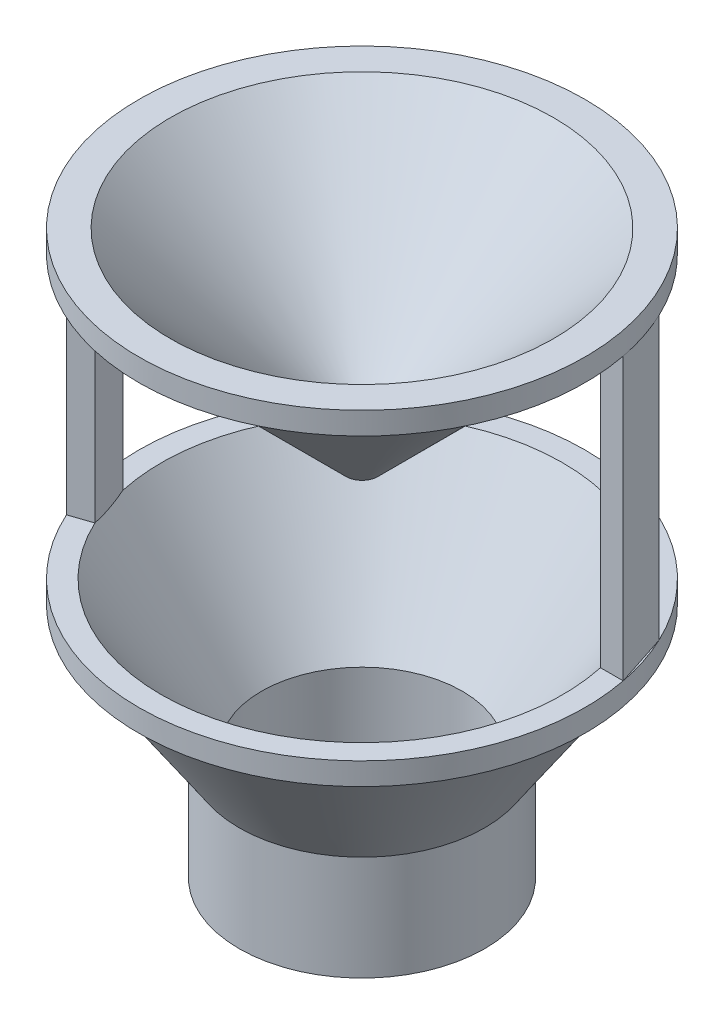
ISO-10303-21;
HEADER;
FILE_DESCRIPTION(('STEP AP214'),'2;1');
FILE_NAME('part.step','',(''),(''),'','','');
FILE_SCHEMA(('AUTOMOTIVE_DESIGN { 1 0 10303 214 1 1 1 1 }'));
ENDSEC;
DATA;
#1=APPLICATION_CONTEXT('core data for automotive mechanical design processes');
#2=APPLICATION_PROTOCOL_DEFINITION('international standard','automotive_design',2000,#1);
#3=PRODUCT_CONTEXT('',#1,'mechanical');
#4=PRODUCT('Part','Part','',(#3));
#5=PRODUCT_RELATED_PRODUCT_CATEGORY('part','',(#4));
#6=PRODUCT_DEFINITION_FORMATION('','',#4);
#7=PRODUCT_DEFINITION_CONTEXT('part definition',#1,'design');
#8=PRODUCT_DEFINITION('design','',#6,#7);
#9=PRODUCT_DEFINITION_SHAPE('','',#8);
#10=(LENGTH_UNIT() NAMED_UNIT(*) SI_UNIT(.MILLI.,.METRE.));
#11=(NAMED_UNIT(*) PLANE_ANGLE_UNIT() SI_UNIT($,.RADIAN.));
#12=(NAMED_UNIT(*) SI_UNIT($,.STERADIAN.) SOLID_ANGLE_UNIT());
#13=UNCERTAINTY_MEASURE_WITH_UNIT(LENGTH_MEASURE(1.E-05),#10,'distance_accuracy_value','');
#14=(GEOMETRIC_REPRESENTATION_CONTEXT(3) GLOBAL_UNCERTAINTY_ASSIGNED_CONTEXT((#13)) GLOBAL_UNIT_ASSIGNED_CONTEXT((#10,
#11,#12)) REPRESENTATION_CONTEXT('',''));
#15=CARTESIAN_POINT('',(0.,0.,0.));
#16=DIRECTION('',(0.,0.,1.));
#17=DIRECTION('',(1.,0.,0.));
#18=AXIS2_PLACEMENT_3D('',#15,#16,#17);
#19=CARTESIAN_POINT('',(-18.,13.2287565553229,0.));
#20=DIRECTION('',(0.,-1.,0.));
#21=DIRECTION('',(0.,0.,-1.));
#22=AXIS2_PLACEMENT_3D('',#19,#20,#21);
#23=PLANE('',#22);
#24=DIRECTION('',(-0.92606057951431,0.,0.37737488399418));
#25=VECTOR('',#24,1.);
#26=CARTESIAN_POINT('',(-15.8440931576,13.2287565553229,5.29049606778431));
#27=LINE('',#26,#25);
#28=CARTESIAN_POINT('',(18.0866902002161,13.2287565553229,-8.53648859903219));
#29=VERTEX_POINT('',#28);
#30=CARTESIAN_POINT('',(16.2315621436481,13.228756555323,-7.78051350341922));
#31=VERTEX_POINT('',#30);
#32=EDGE_CURVE('E137',#29,#31,#27,.T.);
#33=ORIENTED_EDGE('',*,*,#32,.F.);
#34=CARTESIAN_POINT('',(0.,13.2287565553229,0.));
#35=DIRECTION('',(0.,-1.,0.));
#36=DIRECTION('',(0.,0.,-1.));
#37=AXIS2_PLACEMENT_3D('',#34,#35,#36);
#38=CIRCLE('',#37,20.);
#39=CARTESIAN_POINT('',(-19.4879752206289,13.2287565553229,4.49653442110204));
#40=VERTEX_POINT('',#39);
#41=EDGE_CURVE('E537',#40,#29,#38,.T.);
#42=ORIENTED_EDGE('',*,*,#41,.F.);
#43=DIRECTION('',(-0.94703185385303,0.,0.321139639078848));
#44=VECTOR('',#43,1.);
#45=CARTESIAN_POINT('',(-16.7859272579792,13.2287565553229,3.58026671165951));
#46=LINE('',#45,#44);
#47=CARTESIAN_POINT('',(-17.5833000947419,13.2287565553229,3.8506567982943));
#48=VERTEX_POINT('',#47);
#49=EDGE_CURVE('E500',#48,#40,#46,.T.);
#50=ORIENTED_EDGE('',*,*,#49,.F.);
#51=CARTESIAN_POINT('',(0.,13.228756555323,0.));
#52=DIRECTION('',(0.,-1.,0.));
#53=DIRECTION('',(0.,0.,-1.));
#54=AXIS2_PLACEMENT_3D('',#51,#52,#53);
#55=CIRCLE('',#54,18.);
#56=EDGE_CURVE('E561',#48,#31,#55,.T.);
#57=ORIENTED_EDGE('',*,*,#56,.T.);
#58=EDGE_LOOP('',(#33,#42,#50,#57));
#59=FACE_BOUND('',#58,.T.);
#60=ADVANCED_FACE('F41',(#59),#23,.F.);
#61=DIRECTION('',(-0.310362269932768,0.,-0.950618357387537));
#62=VECTOR('',#61,1.);
#63=CARTESIAN_POINT('',(17.129221258251,13.2287565553229,-11.4691503335197));
#64=LINE('',#63,#62);
#65=CARTESIAN_POINT('',(19.6394429058073,13.2287565553229,-3.78051350341921));
#66=VERTEX_POINT('',#65);
#67=EDGE_CURVE('E455',#66,#29,#64,.T.);
#68=ORIENTED_EDGE('',*,*,#67,.F.);
#69=EDGE_CURVE('E577',#29,#66,#38,.T.);
#70=ORIENTED_EDGE('',*,*,#69,.F.);
#71=EDGE_LOOP('',(#68,#70));
#72=FACE_BOUND('',#71,.T.);
#73=ADVANCED_FACE('F267',(#72),#23,.F.);
#74=DIRECTION('',(1.,0.,0.));
#75=VECTOR('',#74,1.);
#76=CARTESIAN_POINT('',(-18.,13.2287565553229,-3.78051350341923));
#77=LINE('',#76,#75);
#78=CARTESIAN_POINT('',(17.5985146433006,13.228756555323,-3.78051350341921));
#79=VERTEX_POINT('',#78);
#80=EDGE_CURVE('E62',#79,#66,#77,.T.);
#81=ORIENTED_EDGE('',*,*,#80,.F.);
#82=CARTESIAN_POINT('',(-16.2987415384265,13.228756555323,7.63878421370643));
#83=VERTEX_POINT('',#82);
#84=EDGE_CURVE('E560',#79,#83,#55,.T.);
#85=ORIENTED_EDGE('',*,*,#84,.T.);
#86=DIRECTION('',(0.947031853853031,0.,-0.321139639078847));
#87=VECTOR('',#86,1.);
#88=CARTESIAN_POINT('',(-15.5013687016639,13.2287565553229,7.36839412707163));
#89=LINE('',#88,#87);
#90=CARTESIAN_POINT('',(-18.2034166643135,13.2287565553229,8.28466183651417));
#91=VERTEX_POINT('',#90);
#92=EDGE_CURVE('E503',#91,#83,#89,.T.);
#93=ORIENTED_EDGE('',*,*,#92,.F.);
#94=EDGE_CURVE('E531',#66,#91,#38,.T.);
#95=ORIENTED_EDGE('',*,*,#94,.F.);
#96=EDGE_LOOP('',(#81,#85,#93,#95));
#97=FACE_BOUND('',#96,.T.);
#98=ADVANCED_FACE('F225',(#97),#23,.F.);
#99=CARTESIAN_POINT('',(0.,0.,0.));
#100=DIRECTION('',(0.,1.,0.));
#101=DIRECTION('',(0.,0.,1.));
#102=AXIS2_PLACEMENT_3D('',#99,#100,#101);
#103=CONICAL_SURFACE('',#102,9.,0.59740641664535);
#104=CARTESIAN_POINT('',(0.,0.,0.));
#105=DIRECTION('',(0.,-1.,0.));
#106=DIRECTION('',(0.,0.,-1.));
#107=AXIS2_PLACEMENT_3D('',#104,#105,#106);
#108=CIRCLE('',#107,9.);
#109=CARTESIAN_POINT('',(0.,0.,-9.));
#110=VERTEX_POINT('',#109);
#111=EDGE_CURVE('E557',#110,#110,#108,.T.);
#112=ORIENTED_EDGE('',*,*,#111,.T.);
#113=EDGE_LOOP('',(#112));
#114=FACE_BOUND('',#113,.T.);
#115=CARTESIAN_POINT('',(17.0465181752272,13.2287741326992,-5.78071350341921));
#116=CARTESIAN_POINT('',(17.138526785594,13.1994453425449,-5.44731350341921));
#117=CARTESIAN_POINT('',(17.2305353959608,13.1847809474677,-5.11391350341921));
#118=CARTESIAN_POINT('',(17.4145526166944,13.1847809474677,-4.44711350341921));
#119=CARTESIAN_POINT('',(17.5065612270612,13.1994453425449,-4.11371350341921));
#120=CARTESIAN_POINT('',(17.598569837428,13.2287741326992,-3.78031350341921));
#121=B_SPLINE_CURVE_WITH_KNOTS('',3,(#115,#116,#117,#118,#119,#120),.UNSPECIFIED.,.F.,.F.,(4,2,
4),(0.,1.03852091927967,2.07704183855933),.UNSPECIFIED.);
#122=CARTESIAN_POINT('',(17.0465733693546,13.2287565553229,-5.78051350341921));
#123=VERTEX_POINT('',#122);
#124=EDGE_CURVE('E214',#123,#79,#121,.T.);
#125=ORIENTED_EDGE('',*,*,#124,.F.);
#126=CARTESIAN_POINT('',(16.2314806425256,13.2287756010906,-7.78071350341921));
#127=CARTESIAN_POINT('',(16.3673430138508,13.1969945114193,-7.44731350341921));
#128=CARTESIAN_POINT('',(16.5032053851761,13.1811039665836,-7.11391350341921));
#129=CARTESIAN_POINT('',(16.7749301278266,13.1811039665836,-6.44711350341921));
#130=CARTESIAN_POINT('',(16.9107924991519,13.1969945114193,-6.11371350341921));
#131=CARTESIAN_POINT('',(17.0466548704771,13.2287756010906,-5.78031350341921));
#132=B_SPLINE_CURVE_WITH_KNOTS('',3,(#126,#127,#128,#129,#130,#131),.UNSPECIFIED.,.F.,.F.,(4,2,
4),(0.,1.08111048474042,2.16222096948085),.UNSPECIFIED.);
#133=EDGE_CURVE('E70',#31,#123,#132,.T.);
#134=ORIENTED_EDGE('',*,*,#133,.F.);
#135=ORIENTED_EDGE('',*,*,#56,.F.);
#136=CARTESIAN_POINT('',(-16.2986737181863,13.2287910476154,7.63898421370642));
#137=CARTESIAN_POINT('',(-16.3519147051474,13.2017066190668,7.48197802559658));
#138=CARTESIAN_POINT('',(-16.405322491275,13.1778746899669,7.32447995138902));
#139=CARTESIAN_POINT('',(-16.5124046262886,13.1368843818071,7.00869771682161));
#140=CARTESIAN_POINT('',(-16.5660789917004,13.1197264218444,6.85041350772768));
#141=CARTESIAN_POINT('',(-16.7266532034287,13.078709404509,6.37688462835854));
#142=CARTESIAN_POINT('',(-16.8338370100064,13.0649313695642,6.06080256717945));
#143=CARTESIAN_POINT('',(-17.0482046231619,13.0649313695642,5.42863844482127));
#144=CARTESIAN_POINT('',(-17.1553884297397,13.078709404509,5.11255638364219));
#145=CARTESIAN_POINT('',(-17.315962641468,13.1197264218444,4.63902750427304));
#146=CARTESIAN_POINT('',(-17.3696370068797,13.1368843818071,4.48074329517912));
#147=CARTESIAN_POINT('',(-17.4767191418934,13.1778746899669,4.1649610606117));
#148=CARTESIAN_POINT('',(-17.530126928021,13.2017066190668,4.00746298640414));
#149=CARTESIAN_POINT('',(-17.5833679149821,13.2287910476154,3.8504567982943));
#150=B_SPLINE_CURVE_WITH_KNOTS('',3,(#136,#137,#138,#139,#140,#141,#142,#143,#144,#145,#146,
#147,#148,#149),.UNSPECIFIED.,.F.,.F.,(4,2,2,2,2,2,4),(0.,0.503897281712493,1.00782620094,
2.00876652283777,3.00970684473553,3.51363576396304,4.01753304567553),.UNSPECIFIED.);
#151=EDGE_CURVE('E128',#83,#48,#150,.T.);
#152=ORIENTED_EDGE('',*,*,#151,.F.);
#153=ORIENTED_EDGE('',*,*,#84,.F.);
#154=EDGE_LOOP('',(#125,#134,#135,#152,#153));
#155=FACE_BOUND('',#154,.T.);
#156=ADVANCED_FACE('F221',(#114,#155),#103,.F.);
#157=CARTESIAN_POINT('',(18.,38.4444165224714,0.));
#158=DIRECTION('',(0.,-1.,0.));
#159=DIRECTION('',(0.,0.,-1.));
#160=AXIS2_PLACEMENT_3D('',#157,#158,#159);
#161=PLANE('',#160);
#162=CARTESIAN_POINT('',(0.,38.4444165224714,0.));
#163=DIRECTION('',(0.,-1.,0.));
#164=DIRECTION('',(0.,0.,-1.));
#165=AXIS2_PLACEMENT_3D('',#162,#163,#164);
#166=CIRCLE('',#165,20.);
#167=CARTESIAN_POINT('',(-19.4879752206289,38.4444165224714,4.49653442110204));
#168=VERTEX_POINT('',#167);
#169=CARTESIAN_POINT('',(18.0866902002161,38.4444165224714,-8.53648859903214));
#170=VERTEX_POINT('',#169);
#171=EDGE_CURVE('E148',#168,#170,#166,.T.);
#172=ORIENTED_EDGE('',*,*,#171,.T.);
#173=DIRECTION('',(0.92606057951431,0.,-0.37737488399418));
#174=VECTOR('',#173,1.);
#175=CARTESIAN_POINT('',(16.2315621436481,38.4444165224714,-7.78051350341921));
#176=LINE('',#175,#174);
#177=CARTESIAN_POINT('',(16.2315621436481,38.4444165224714,-7.78051350341921));
#178=VERTEX_POINT('',#177);
#179=EDGE_CURVE('E135',#178,#170,#176,.T.);
#180=ORIENTED_EDGE('',*,*,#179,.F.);
#181=CARTESIAN_POINT('',(0.,38.4444165224714,0.));
#182=DIRECTION('',(0.,-1.,0.));
#183=DIRECTION('',(0.,0.,-1.));
#184=AXIS2_PLACEMENT_3D('',#181,#182,#183);
#185=CIRCLE('',#184,18.);
#186=CARTESIAN_POINT('',(-17.5833000947419,38.4444165224714,3.8506567982943));
#187=VERTEX_POINT('',#186);
#188=EDGE_CURVE('E145',#187,#178,#185,.T.);
#189=ORIENTED_EDGE('',*,*,#188,.F.);
#190=DIRECTION('',(0.94703185385303,0.,-0.321139639078848));
#191=VECTOR('',#190,1.);
#192=CARTESIAN_POINT('',(-17.5833000947419,38.4444165224714,3.8506567982943));
#193=LINE('',#192,#191);
#194=EDGE_CURVE('E498',#168,#187,#193,.T.);
#195=ORIENTED_EDGE('',*,*,#194,.F.);
#196=EDGE_LOOP('',(#172,#180,#189,#195));
#197=FACE_BOUND('',#196,.T.);
#198=ADVANCED_FACE('F144',(#197),#161,.T.);
#199=CARTESIAN_POINT('',(19.6394429058073,38.4444165224714,-3.78051350341921));
#200=VERTEX_POINT('',#199);
#201=EDGE_CURVE('E460',#170,#200,#166,.T.);
#202=ORIENTED_EDGE('',*,*,#201,.T.);
#203=DIRECTION('',(0.310362269932768,0.,0.950618357387538));
#204=VECTOR('',#203,1.);
#205=CARTESIAN_POINT('',(18.0866902002161,38.4444165224714,-8.53648859903214));
#206=LINE('',#205,#204);
#207=EDGE_CURVE('E150',#170,#200,#206,.T.);
#208=ORIENTED_EDGE('',*,*,#207,.F.);
#209=EDGE_LOOP('',(#202,#208));
#210=FACE_BOUND('',#209,.T.);
#211=ADVANCED_FACE('F292',(#210),#161,.T.);
#212=CARTESIAN_POINT('',(17.5985146433006,38.4444165224714,-3.78051350341921));
#213=VERTEX_POINT('',#212);
#214=CARTESIAN_POINT('',(-16.2987415384265,38.4444165224714,7.63878421370644));
#215=VERTEX_POINT('',#214);
#216=EDGE_CURVE('E156',#213,#215,#185,.T.);
#217=ORIENTED_EDGE('',*,*,#216,.F.);
#218=DIRECTION('',(-1.,0.,0.));
#219=VECTOR('',#218,1.);
#220=CARTESIAN_POINT('',(19.6394429058073,38.4444165224714,-3.78051350341921));
#221=LINE('',#220,#219);
#222=EDGE_CURVE('E437',#200,#213,#221,.T.);
#223=ORIENTED_EDGE('',*,*,#222,.F.);
#224=CARTESIAN_POINT('',(-18.2034166643135,38.4444165224714,8.28466183651417));
#225=VERTEX_POINT('',#224);
#226=EDGE_CURVE('E458',#200,#225,#166,.T.);
#227=ORIENTED_EDGE('',*,*,#226,.T.);
#228=DIRECTION('',(-0.947031853853031,0.,0.321139639078847));
#229=VECTOR('',#228,1.);
#230=CARTESIAN_POINT('',(-18.2034166643135,38.4444165224714,8.28466183651417));
#231=LINE('',#230,#229);
#232=EDGE_CURVE('E511',#215,#225,#231,.T.);
#233=ORIENTED_EDGE('',*,*,#232,.F.);
#234=EDGE_LOOP('',(#217,#223,#227,#233));
#235=FACE_BOUND('',#234,.T.);
#236=ADVANCED_FACE('F181',(#235),#161,.T.);
#237=CARTESIAN_POINT('',(0.,21.8725465406691,0.));
#238=DIRECTION('',(0.,1.,0.));
#239=DIRECTION('',(0.,0.,1.));
#240=AXIS2_PLACEMENT_3D('',#237,#238,#239);
#241=CONICAL_SURFACE('',#240,1.42813001819775,0.785398163397447);
#242=CARTESIAN_POINT('',(0.,21.8725465406691,0.));
#243=DIRECTION('',(0.,-1.,0.));
#244=DIRECTION('',(0.,0.,-1.));
#245=AXIS2_PLACEMENT_3D('',#242,#243,#244);
#246=CIRCLE('',#245,1.42813001819775);
#247=CARTESIAN_POINT('',(0.,21.8725465406691,-1.42813001819775));
#248=VERTEX_POINT('',#247);
#249=EDGE_CURVE('E162',#248,#248,#246,.T.);
#250=ORIENTED_EDGE('',*,*,#249,.F.);
#251=EDGE_LOOP('',(#250));
#252=FACE_BOUND('',#251,.T.);
#253=CARTESIAN_POINT('',(16.2314806425256,38.4444294799937,-7.78071350341921));
#254=CARTESIAN_POINT('',(16.3673430138508,38.422807658937,-7.44731350341921));
#255=CARTESIAN_POINT('',(16.5032053851761,38.4119967484087,-7.11391350341921));
#256=CARTESIAN_POINT('',(16.7749301278266,38.4119967484087,-6.44711350341921));
#257=CARTESIAN_POINT('',(16.9107924991519,38.422807658937,-6.11371350341921));
#258=CARTESIAN_POINT('',(17.0466548704771,38.4444294799937,-5.78031350341921));
#259=B_SPLINE_CURVE_WITH_KNOTS('',3,(#253,#254,#255,#256,#257,#258),.UNSPECIFIED.,.F.,.F.,(4,2,
4),(0.,1.08054577763146,2.16109155526292),.UNSPECIFIED.);
#260=CARTESIAN_POINT('',(17.0465733693546,38.4444165224714,-5.78051350341901));
#261=VERTEX_POINT('',#260);
#262=EDGE_CURVE('E55',#178,#261,#259,.T.);
#263=ORIENTED_EDGE('',*,*,#262,.T.);
#264=CARTESIAN_POINT('',(17.0465181752272,38.4444284809941,-5.78071350341921));
#265=CARTESIAN_POINT('',(17.138526785594,38.4244750477077,-5.44731350341921));
#266=CARTESIAN_POINT('',(17.2305353959608,38.4144983310645,-5.11391350341921));
#267=CARTESIAN_POINT('',(17.4145526166944,38.4144983310645,-4.44711350341921));
#268=CARTESIAN_POINT('',(17.5065612270612,38.4244750477077,-4.11371350341921));
#269=CARTESIAN_POINT('',(17.598569837428,38.4444284809941,-3.78031350341921));
#270=B_SPLINE_CURVE_WITH_KNOTS('',3,(#264,#265,#266,#267,#268,#269),.UNSPECIFIED.,.F.,.F.,(4,2,
4),(0.,1.03802028559633,2.07604057119265),.UNSPECIFIED.);
#271=EDGE_CURVE('E11',#261,#213,#270,.T.);
#272=ORIENTED_EDGE('',*,*,#271,.T.);
#273=ORIENTED_EDGE('',*,*,#216,.T.);
#274=CARTESIAN_POINT('',(-17.5833679149821,38.4444399888214,3.8504567982943));
#275=CARTESIAN_POINT('',(-17.4765859992348,38.4074245705533,4.16535369460475));
#276=CARTESIAN_POINT('',(-17.3694723952275,38.3795256229127,4.48122873035816));
#277=CARTESIAN_POINT('',(-17.1552454519501,38.3423220994446,5.11297802116276));
#278=CARTESIAN_POINT('',(-17.0481331342671,38.3329603424697,5.42884926358156));
#279=CARTESIAN_POINT('',(-16.8339084989013,38.3329603424697,6.06059174841916));
#280=CARTESIAN_POINT('',(-16.7267961812183,38.3423220994446,6.37646299083796));
#281=CARTESIAN_POINT('',(-16.5125692379409,38.3795256229127,7.00821228164256));
#282=CARTESIAN_POINT('',(-16.4054556339336,38.4074245705533,7.32408731739598));
#283=CARTESIAN_POINT('',(-16.2986737181863,38.4444399888214,7.63898421370642));
#284=B_SPLINE_CURVE_WITH_KNOTS('',3,(#274,#275,#276,#277,#278,#279,#280,#281,#282,#283),
.UNSPECIFIED.,.F.,.F.,(4,2,2,2,4),(0.,1.00359263996499,2.00408467330924,3.00457670665349,
4.00816934661848),.UNSPECIFIED.);
#285=EDGE_CURVE('E154',#187,#215,#284,.T.);
#286=ORIENTED_EDGE('',*,*,#285,.F.);
#287=ORIENTED_EDGE('',*,*,#188,.T.);
#288=EDGE_LOOP('',(#263,#272,#273,#286,#287));
#289=FACE_BOUND('',#288,.T.);
#290=ADVANCED_FACE('F152',(#252,#289),#241,.T.);
#291=DIRECTION('',(0.321139639078845,0.,0.947031853853031));
#292=VECTOR('',#291,1.);
#293=CARTESIAN_POINT('',(-20.7020479626496,13.2287565553229,0.916267709442525));
#294=LINE('',#293,#292);
#295=EDGE_CURVE('E528',#40,#91,#294,.T.);
#296=ORIENTED_EDGE('',*,*,#295,.F.);
#297=EDGE_CURVE('E532',#91,#40,#38,.T.);
#298=ORIENTED_EDGE('',*,*,#297,.F.);
#299=EDGE_LOOP('',(#296,#298));
#300=FACE_BOUND('',#299,.T.);
#301=ADVANCED_FACE('F180',(#300),#23,.F.);
#302=CARTESIAN_POINT('',(0.,0.,0.));
#303=DIRECTION('',(0.,-1.,0.));
#304=DIRECTION('',(0.,0.,-1.));
#305=AXIS2_PLACEMENT_3D('',#302,#303,#304);
#306=CYLINDRICAL_SURFACE('',#305,9.);
#307=ORIENTED_EDGE('',*,*,#111,.F.);
#308=EDGE_LOOP('',(#307));
#309=FACE_BOUND('',#308,.T.);
#310=CARTESIAN_POINT('',(0.,-10.,0.));
#311=DIRECTION('',(0.,-1.,0.));
#312=DIRECTION('',(0.,0.,-1.));
#313=AXIS2_PLACEMENT_3D('',#310,#311,#312);
#314=CIRCLE('',#313,9.);
#315=CARTESIAN_POINT('',(0.,-10.,-9.));
#316=VERTEX_POINT('',#315);
#317=EDGE_CURVE('E553',#316,#316,#314,.T.);
#318=ORIENTED_EDGE('',*,*,#317,.T.);
#319=EDGE_LOOP('',(#318));
#320=FACE_BOUND('',#319,.T.);
#321=ADVANCED_FACE('F227',(#309,#320),#306,.F.);
#322=CARTESIAN_POINT('',(-9.,-10.,0.));
#323=DIRECTION('',(0.,-1.,0.));
#324=DIRECTION('',(0.,0.,-1.));
#325=AXIS2_PLACEMENT_3D('',#322,#323,#324);
#326=PLANE('',#325);
#327=CARTESIAN_POINT('',(0.,-10.,0.));
#328=DIRECTION('',(0.,-1.,0.));
#329=DIRECTION('',(0.,0.,-1.));
#330=AXIS2_PLACEMENT_3D('',#327,#328,#329);
#331=CIRCLE('',#330,11.);
#332=CARTESIAN_POINT('',(0.,-10.,-11.));
#333=VERTEX_POINT('',#332);
#334=EDGE_CURVE('E549',#333,#333,#331,.T.);
#335=ORIENTED_EDGE('',*,*,#334,.T.);
#336=EDGE_LOOP('',(#335));
#337=FACE_BOUND('',#336,.T.);
#338=ORIENTED_EDGE('',*,*,#317,.F.);
#339=EDGE_LOOP('',(#338));
#340=FACE_BOUND('',#339,.T.);
#341=ADVANCED_FACE('F232',(#337,#340),#326,.T.);
#342=CARTESIAN_POINT('',(0.,0.,0.));
#343=DIRECTION('',(0.,-1.,0.));
#344=DIRECTION('',(0.,0.,-1.));
#345=AXIS2_PLACEMENT_3D('',#342,#343,#344);
#346=CYLINDRICAL_SURFACE('',#345,11.);
#347=CARTESIAN_POINT('',(0.,-0.615831876594899,0.));
#348=DIRECTION('',(0.,-1.,0.));
#349=DIRECTION('',(0.,0.,-1.));
#350=AXIS2_PLACEMENT_3D('',#347,#348,#349);
#351=CIRCLE('',#350,11.);
#352=CARTESIAN_POINT('',(0.,-0.615831876594899,-11.));
#353=VERTEX_POINT('',#352);
#354=EDGE_CURVE('E545',#353,#353,#351,.T.);
#355=ORIENTED_EDGE('',*,*,#354,.T.);
#356=EDGE_LOOP('',(#355));
#357=FACE_BOUND('',#356,.T.);
#358=ORIENTED_EDGE('',*,*,#334,.F.);
#359=EDGE_LOOP('',(#358));
#360=FACE_BOUND('',#359,.T.);
#361=ADVANCED_FACE('F236',(#357,#360),#346,.T.);
#362=CARTESIAN_POINT('',(0.,-0.615831876594899,0.));
#363=DIRECTION('',(0.,1.,0.));
#364=DIRECTION('',(0.,0.,1.));
#365=AXIS2_PLACEMENT_3D('',#362,#363,#364);
#366=CONICAL_SURFACE('',#365,11.,0.59740641664535);
#367=CARTESIAN_POINT('',(0.,11.2287565553229,0.));
#368=DIRECTION('',(0.,-1.,0.));
#369=DIRECTION('',(0.,0.,-1.));
#370=AXIS2_PLACEMENT_3D('',#367,#368,#369);
#371=CIRCLE('',#370,19.0583005244258);
#372=CARTESIAN_POINT('',(0.,11.2287565553229,-19.0583005244258));
#373=VERTEX_POINT('',#372);
#374=EDGE_CURVE('E541',#373,#373,#371,.T.);
#375=ORIENTED_EDGE('',*,*,#374,.T.);
#376=EDGE_LOOP('',(#375));
#377=FACE_BOUND('',#376,.T.);
#378=ORIENTED_EDGE('',*,*,#354,.F.);
#379=EDGE_LOOP('',(#378));
#380=FACE_BOUND('',#379,.T.);
#381=ADVANCED_FACE('F240',(#377,#380),#366,.T.);
#382=CARTESIAN_POINT('',(-18.,11.2287565553229,0.));
#383=DIRECTION('',(0.,-1.,0.));
#384=DIRECTION('',(0.,0.,-1.));
#385=AXIS2_PLACEMENT_3D('',#382,#383,#384);
#386=PLANE('',#385);
#387=CARTESIAN_POINT('',(0.,11.2287565553229,0.));
#388=DIRECTION('',(0.,-1.,0.));
#389=DIRECTION('',(0.,0.,-1.));
#390=AXIS2_PLACEMENT_3D('',#387,#388,#389);
#391=CIRCLE('',#390,20.);
#392=CARTESIAN_POINT('',(0.,11.2287565553229,-20.));
#393=VERTEX_POINT('',#392);
#394=EDGE_CURVE('E536',#393,#393,#391,.T.);
#395=ORIENTED_EDGE('',*,*,#394,.T.);
#396=EDGE_LOOP('',(#395));
#397=FACE_BOUND('',#396,.T.);
#398=ORIENTED_EDGE('',*,*,#374,.F.);
#399=EDGE_LOOP('',(#398));
#400=FACE_BOUND('',#399,.T.);
#401=ADVANCED_FACE('F244',(#397,#400),#386,.T.);
#402=CARTESIAN_POINT('',(0.,0.,0.));
#403=DIRECTION('',(0.,-1.,0.));
#404=DIRECTION('',(0.,0.,-1.));
#405=AXIS2_PLACEMENT_3D('',#402,#403,#404);
#406=CYLINDRICAL_SURFACE('',#405,20.);
#407=ORIENTED_EDGE('',*,*,#41,.T.);
#408=ORIENTED_EDGE('',*,*,#69,.T.);
#409=ORIENTED_EDGE('',*,*,#94,.T.);
#410=ORIENTED_EDGE('',*,*,#297,.T.);
#411=EDGE_LOOP('',(#407,#408,#409,#410));
#412=FACE_BOUND('',#411,.T.);
#413=ORIENTED_EDGE('',*,*,#394,.F.);
#414=EDGE_LOOP('',(#413));
#415=FACE_BOUND('',#414,.T.);
#416=ADVANCED_FACE('F248',(#412,#415),#406,.T.);
#417=CARTESIAN_POINT('',(-16.2987415384265,12.4444165224714,7.63878421370643));
#418=DIRECTION('',(-0.947031853853031,0.,0.321139639078845));
#419=DIRECTION('',(0.321139639078845,0.,0.947031853853031));
#420=AXIS2_PLACEMENT_3D('',#417,#418,#419);
#421=PLANE('',#420);
#422=DIRECTION('',(0.,1.,0.));
#423=VECTOR('',#422,1.);
#424=CARTESIAN_POINT('',(-17.5833000947419,12.4444165224714,3.8506567982943));
#425=LINE('',#424,#423);
#426=EDGE_CURVE('E504',#48,#187,#425,.T.);
#427=ORIENTED_EDGE('',*,*,#426,.T.);
#428=ORIENTED_EDGE('',*,*,#285,.T.);
#429=DIRECTION('',(0.,1.,0.));
#430=VECTOR('',#429,1.);
#431=CARTESIAN_POINT('',(-16.2987415384265,12.4444165224714,7.63878421370643));
#432=LINE('',#431,#430);
#433=EDGE_CURVE('E517',#83,#215,#432,.T.);
#434=ORIENTED_EDGE('',*,*,#433,.F.);
#435=ORIENTED_EDGE('',*,*,#151,.T.);
#436=EDGE_LOOP('',(#427,#428,#434,#435));
#437=FACE_BOUND('',#436,.T.);
#438=ADVANCED_FACE('F172',(#437),#421,.F.);
#439=CARTESIAN_POINT('',(-19.4879752206289,12.4444165224714,4.49653442110204));
#440=DIRECTION('',(0.947031853853031,0.,-0.321139639078845));
#441=DIRECTION('',(-0.321139639078845,0.,-0.947031853853031));
#442=AXIS2_PLACEMENT_3D('',#439,#440,#441);
#443=PLANE('',#442);
#444=DIRECTION('',(0.,1.,0.));
#445=VECTOR('',#444,1.);
#446=CARTESIAN_POINT('',(-19.4879752206289,12.4444165224714,4.49653442110204));
#447=LINE('',#446,#445);
#448=EDGE_CURVE('E497',#40,#168,#447,.T.);
#449=ORIENTED_EDGE('',*,*,#448,.F.);
#450=ORIENTED_EDGE('',*,*,#295,.T.);
#451=DIRECTION('',(0.,1.,0.));
#452=VECTOR('',#451,1.);
#453=CARTESIAN_POINT('',(-18.2034166643135,12.4444165224714,8.28466183651417));
#454=LINE('',#453,#452);
#455=EDGE_CURVE('E507',#91,#225,#454,.T.);
#456=ORIENTED_EDGE('',*,*,#455,.T.);
#457=DIRECTION('',(-0.321139639078845,0.,-0.947031853853031));
#458=VECTOR('',#457,1.);
#459=CARTESIAN_POINT('',(-19.4879752206289,38.4444165224714,4.49653442110204));
#460=LINE('',#459,#458);
#461=EDGE_CURVE('E160',#225,#168,#460,.T.);
#462=ORIENTED_EDGE('',*,*,#461,.T.);
#463=EDGE_LOOP('',(#449,#450,#456,#462));
#464=FACE_BOUND('',#463,.T.);
#465=ADVANCED_FACE('F253',(#464),#443,.F.);
#466=CARTESIAN_POINT('',(-17.5833000947419,12.4444165224714,3.8506567982943));
#467=DIRECTION('',(0.321139639078848,0.,0.94703185385303));
#468=DIRECTION('',(0.94703185385303,0.,-0.321139639078848));
#469=AXIS2_PLACEMENT_3D('',#466,#467,#468);
#470=PLANE('',#469);
#471=ORIENTED_EDGE('',*,*,#426,.F.);
#472=ORIENTED_EDGE('',*,*,#49,.T.);
#473=ORIENTED_EDGE('',*,*,#448,.T.);
#474=ORIENTED_EDGE('',*,*,#194,.T.);
#475=EDGE_LOOP('',(#471,#472,#473,#474));
#476=FACE_BOUND('',#475,.T.);
#477=ADVANCED_FACE('F255',(#476),#470,.F.);
#478=CARTESIAN_POINT('',(-18.2034166643135,12.4444165224714,8.28466183651417));
#479=DIRECTION('',(-0.321139639078847,0.,-0.94703185385303));
#480=DIRECTION('',(-0.947031853853031,0.,0.321139639078847));
#481=AXIS2_PLACEMENT_3D('',#478,#479,#480);
#482=PLANE('',#481);
#483=ORIENTED_EDGE('',*,*,#455,.F.);
#484=ORIENTED_EDGE('',*,*,#92,.T.);
#485=ORIENTED_EDGE('',*,*,#433,.T.);
#486=ORIENTED_EDGE('',*,*,#232,.T.);
#487=EDGE_LOOP('',(#483,#484,#485,#486));
#488=FACE_BOUND('',#487,.T.);
#489=ADVANCED_FACE('F258',(#488),#482,.F.);
#490=ORIENTED_EDGE('',*,*,#461,.F.);
#491=EDGE_CURVE('E462',#225,#168,#166,.T.);
#492=ORIENTED_EDGE('',*,*,#491,.T.);
#493=EDGE_LOOP('',(#490,#492));
#494=FACE_BOUND('',#493,.T.);
#495=ADVANCED_FACE('F263',(#494),#161,.T.);
#496=CARTESIAN_POINT('',(0.,21.8725465406691,0.));
#497=DIRECTION('',(0.,-1.,0.));
#498=DIRECTION('',(0.,0.,-1.));
#499=AXIS2_PLACEMENT_3D('',#496,#497,#498);
#500=CONICAL_SURFACE('',#499,1.42813001819775,0.78539816339745);
#501=CARTESIAN_POINT('',(0.,23.2867601030422,0.));
#502=DIRECTION('',(0.,-1.,0.));
#503=DIRECTION('',(0.,0.,-1.));
#504=AXIS2_PLACEMENT_3D('',#501,#502,#503);
#505=CIRCLE('',#504,0.0139164558246513);
#506=CARTESIAN_POINT('',(0.,23.2867601030422,-0.0139164558246496));
#507=VERTEX_POINT('',#506);
#508=EDGE_CURVE('E475',#507,#507,#505,.T.);
#509=CARTESIAN_POINT('',(0.,23.2867601030422,-0.0139164558246496));
#510=CARTESIAN_POINT('',(0.,23.2720287117674,-0.0286478470993697));
#511=CARTESIAN_POINT('',(0.,23.2572973204927,-0.0433792383740891));
#512=CARTESIAN_POINT('',(0.,23.2278345379433,-0.0728420209235283));
#513=CARTESIAN_POINT('',(0.,23.2131031466686,-0.0875734121982479));
#514=CARTESIAN_POINT('',(0.,23.1836403641191,-0.117036194747688));
#515=CARTESIAN_POINT('',(0.,23.1689089728444,-0.131767586022408));
#516=CARTESIAN_POINT('',(0.,23.139446190295,-0.161230368571847));
#517=CARTESIAN_POINT('',(0.,23.1247147990202,-0.175961759846567));
#518=CARTESIAN_POINT('',(0.,23.0952520164708,-0.205424542396006));
#519=CARTESIAN_POINT('',(0.,23.0805206251961,-0.220155933670726));
#520=CARTESIAN_POINT('',(0.,23.0510578426466,-0.249618716220166));
#521=CARTESIAN_POINT('',(0.,23.0363264513719,-0.264350107494885));
#522=CARTESIAN_POINT('',(0.,23.0068636688225,-0.293812890044325));
#523=CARTESIAN_POINT('',(0.,22.9921322775478,-0.308544281319045));
#524=CARTESIAN_POINT('',(0.,22.9626694949983,-0.338007063868485));
#525=CARTESIAN_POINT('',(0.,22.9479381037236,-0.352738455143204));
#526=CARTESIAN_POINT('',(0.,22.9184753211742,-0.382201237692643));
#527=CARTESIAN_POINT('',(0.,22.9037439298994,-0.396932628967364));
#528=CARTESIAN_POINT('',(0.,22.87428114735,-0.426395411516803));
#529=CARTESIAN_POINT('',(0.,22.8595497560753,-0.441126802791522));
#530=CARTESIAN_POINT('',(0.,22.8300869735258,-0.470589585340962));
#531=CARTESIAN_POINT('',(0.,22.8153555822511,-0.485320976615682));
#532=CARTESIAN_POINT('',(0.,22.7858927997017,-0.514783759165122));
#533=CARTESIAN_POINT('',(0.,22.771161408427,-0.529515150439841));
#534=CARTESIAN_POINT('',(0.,22.7416986258775,-0.55897793298928));
#535=CARTESIAN_POINT('',(0.,22.7269672346028,-0.573709324264001));
#536=CARTESIAN_POINT('',(0.,22.6975044520534,-0.60317210681344));
#537=CARTESIAN_POINT('',(0.,22.6827730607786,-0.617903498088159));
#538=CARTESIAN_POINT('',(0.,22.6533102782292,-0.647366280637599));
#539=CARTESIAN_POINT('',(0.,22.6385788869545,-0.662097671912319));
#540=CARTESIAN_POINT('',(0.,22.609116104405,-0.691560454461759));
#541=CARTESIAN_POINT('',(0.,22.5943847131303,-0.706291845736479));
#542=CARTESIAN_POINT('',(0.,22.5649219305809,-0.735754628285918));
#543=CARTESIAN_POINT('',(0.,22.5501905393062,-0.750486019560637));
#544=CARTESIAN_POINT('',(0.,22.5207277567567,-0.779948802110077));
#545=CARTESIAN_POINT('',(0.,22.505996365482,-0.794680193384797));
#546=CARTESIAN_POINT('',(0.,22.4765335829326,-0.824142975934237));
#547=CARTESIAN_POINT('',(0.,22.4618021916578,-0.838874367208956));
#548=CARTESIAN_POINT('',(0.,22.4323394091084,-0.868337149758395));
#549=CARTESIAN_POINT('',(0.,22.4176080178337,-0.883068541033116));
#550=CARTESIAN_POINT('',(0.,22.3881452352842,-0.912531323582555));
#551=CARTESIAN_POINT('',(0.,22.3734138440095,-0.927262714857275));
#552=CARTESIAN_POINT('',(0.,22.3439510614601,-0.956725497406714));
#553=CARTESIAN_POINT('',(0.,22.3292196701854,-0.971456888681435));
#554=CARTESIAN_POINT('',(0.,22.2997568876359,-1.00091967123087));
#555=CARTESIAN_POINT('',(0.,22.2850254963612,-1.01565106250559));
#556=CARTESIAN_POINT('',(0.,22.2555627138118,-1.04511384505503));
#557=CARTESIAN_POINT('',(0.,22.2408313225371,-1.05984523632975));
#558=CARTESIAN_POINT('',(0.,22.2113685399876,-1.08930801887919));
#559=CARTESIAN_POINT('',(0.,22.1966371487129,-1.10403941015391));
#560=CARTESIAN_POINT('',(0.,22.1671743661635,-1.13350219270335));
#561=CARTESIAN_POINT('',(0.,22.1524429748887,-1.14823358397807));
#562=CARTESIAN_POINT('',(0.,22.1229801923393,-1.17769636652751));
#563=CARTESIAN_POINT('',(0.,22.1082488010646,-1.19242775780223));
#564=CARTESIAN_POINT('',(0.,22.0787860185151,-1.22189054035167));
#565=CARTESIAN_POINT('',(0.,22.0640546272404,-1.23662193162639));
#566=CARTESIAN_POINT('',(0.,22.034591844691,-1.26608471417583));
#567=CARTESIAN_POINT('',(0.,22.0198604534163,-1.28081610545055));
#568=CARTESIAN_POINT('',(0.,21.9903976708668,-1.31027888799999));
#569=CARTESIAN_POINT('',(0.,21.9756662795921,-1.32501027927471));
#570=CARTESIAN_POINT('',(0.,21.9462034970427,-1.35447306182415));
#571=CARTESIAN_POINT('',(0.,21.9314721057679,-1.36920445309887));
#572=CARTESIAN_POINT('',(0.,21.9020093232185,-1.39866723564831));
#573=CARTESIAN_POINT('',(0.,21.8872779319438,-1.41339862692303));
#574=CARTESIAN_POINT('',(0.,21.8725465406691,-1.42813001819775));
#575=B_SPLINE_CURVE_WITH_KNOTS('',3,(#509,#510,#511,#512,#513,#514,#515,#516,#517,#518,#519,
#520,#521,#522,#523,#524,#525,#526,#527,#528,#529,#530,#531,#532,#533,#534,#535,#536,#537,#538,
#539,#540,#541,#542,#543,#544,#545,#546,#547,#548,#549,#550,#551,#552,#553,#554,#555,#556,#557,
#558,#559,#560,#561,#562,#563,#564,#565,#566,#567,#568,#569,#570,#571,#572,#573,#574),
.UNSPECIFIED.,.F.,.F.,(4,2,2,2,2,2,2,2,2,2,2,2,2,2,2,2,2,2,2,2,2,2,2,2,2,2,2,2,2,2,2,2,4),(0.,
0.062500000000001,0.125000000000002,0.187500000000001,0.250000000000002,0.312500000000001,
0.375000000000002,0.437500000000001,0.500000000000002,0.562500000000001,0.625000000000002,
0.687500000000001,0.750000000000002,0.8125,0.875000000000002,0.9375,1.,1.0625,1.125,1.1875,1.25,
1.3125,1.375,1.4375,1.5,1.5625,1.625,1.6875,1.75,1.8125,1.875,1.9375,2.),.UNSPECIFIED.);
#576=EDGE_CURVE('BSEAM183',#507,#248,#575,.T.);
#577=ORIENTED_EDGE('',*,*,#508,.F.);
#578=ORIENTED_EDGE('',*,*,#249,.T.);
#579=ORIENTED_EDGE('',*,*,#576,.T.);
#580=ORIENTED_EDGE('',*,*,#576,.F.);
#581=EDGE_LOOP('',(#577,#579,#578,#580));
#582=FACE_BOUND('',#581,.T.);
#583=ADVANCED_FACE('F183',(#582),#500,.F.);
#584=CARTESIAN_POINT('',(0.,23.2867601030422,0.));
#585=DIRECTION('',(0.,1.,0.));
#586=DIRECTION('',(0.,0.,1.));
#587=AXIS2_PLACEMENT_3D('',#584,#585,#586);
#588=CONICAL_SURFACE('',#587,0.0139164558246513,0.785398163397447);
#589=CARTESIAN_POINT('',(0.,40.4444165224714,0.));
#590=DIRECTION('',(0.,-1.,0.));
#591=DIRECTION('',(0.,0.,-1.));
#592=AXIS2_PLACEMENT_3D('',#589,#590,#591);
#593=CIRCLE('',#592,17.1715728752538);
#594=CARTESIAN_POINT('',(0.,40.4444165224714,-17.1715728752538));
#595=VERTEX_POINT('',#594);
#596=EDGE_CURVE('E471',#595,#595,#593,.T.);
#597=ORIENTED_EDGE('',*,*,#596,.F.);
#598=EDGE_LOOP('',(#597));
#599=FACE_BOUND('',#598,.T.);
#600=ORIENTED_EDGE('',*,*,#508,.T.);
#601=EDGE_LOOP('',(#600));
#602=FACE_BOUND('',#601,.T.);
#603=ADVANCED_FACE('F363',(#599,#602),#588,.F.);
#604=CARTESIAN_POINT('',(18.,40.4444165224714,0.));
#605=DIRECTION('',(0.,-1.,0.));
#606=DIRECTION('',(0.,0.,-1.));
#607=AXIS2_PLACEMENT_3D('',#604,#605,#606);
#608=PLANE('',#607);
#609=CARTESIAN_POINT('',(0.,40.4444165224714,0.));
#610=DIRECTION('',(0.,-1.,0.));
#611=DIRECTION('',(0.,0.,-1.));
#612=AXIS2_PLACEMENT_3D('',#609,#610,#611);
#613=CIRCLE('',#612,20.);
#614=CARTESIAN_POINT('',(0.,40.4444165224714,-20.));
#615=VERTEX_POINT('',#614);
#616=EDGE_CURVE('E468',#615,#615,#613,.T.);
#617=ORIENTED_EDGE('',*,*,#616,.F.);
#618=EDGE_LOOP('',(#617));
#619=FACE_BOUND('',#618,.T.);
#620=ORIENTED_EDGE('',*,*,#596,.T.);
#621=EDGE_LOOP('',(#620));
#622=FACE_BOUND('',#621,.T.);
#623=ADVANCED_FACE('F372',(#619,#622),#608,.F.);
#624=CARTESIAN_POINT('',(0.,0.,0.));
#625=DIRECTION('',(0.,-1.,0.));
#626=DIRECTION('',(0.,0.,-1.));
#627=AXIS2_PLACEMENT_3D('',#624,#625,#626);
#628=CYLINDRICAL_SURFACE('',#627,20.);
#629=ORIENTED_EDGE('',*,*,#491,.F.);
#630=ORIENTED_EDGE('',*,*,#226,.F.);
#631=ORIENTED_EDGE('',*,*,#201,.F.);
#632=ORIENTED_EDGE('',*,*,#171,.F.);
#633=EDGE_LOOP('',(#629,#630,#631,#632));
#634=FACE_BOUND('',#633,.T.);
#635=ORIENTED_EDGE('',*,*,#616,.T.);
#636=EDGE_LOOP('',(#635));
#637=FACE_BOUND('',#636,.T.);
#638=ADVANCED_FACE('F381',(#634,#637),#628,.T.);
#639=CARTESIAN_POINT('',(18.0866902002161,12.4444165224714,-8.53648859903214));
#640=DIRECTION('',(-0.950618357387537,0.,0.310362269932768));
#641=DIRECTION('',(0.310362269932768,0.,0.950618357387537));
#642=AXIS2_PLACEMENT_3D('',#639,#640,#641);
#643=PLANE('',#642);
#644=DIRECTION('',(0.,1.,0.));
#645=VECTOR('',#644,1.);
#646=CARTESIAN_POINT('',(19.6394429058073,12.4444165224714,-3.78051350341921));
#647=LINE('',#646,#645);
#648=EDGE_CURVE('E440',#66,#200,#647,.T.);
#649=ORIENTED_EDGE('',*,*,#648,.F.);
#650=ORIENTED_EDGE('',*,*,#67,.T.);
#651=DIRECTION('',(0.,1.,0.));
#652=VECTOR('',#651,1.);
#653=CARTESIAN_POINT('',(18.0866902002161,12.4444165224714,-8.53648859903214));
#654=LINE('',#653,#652);
#655=EDGE_CURVE('E139',#29,#170,#654,.T.);
#656=ORIENTED_EDGE('',*,*,#655,.T.);
#657=ORIENTED_EDGE('',*,*,#207,.T.);
#658=EDGE_LOOP('',(#649,#650,#656,#657));
#659=FACE_BOUND('',#658,.T.);
#660=ADVANCED_FACE('F390',(#659),#643,.F.);
#661=CARTESIAN_POINT('',(17.5985146433006,12.4444165224714,-3.78051350341921));
#662=DIRECTION('',(0.963965784398606,0.,-0.26602625154067));
#663=DIRECTION('',(-0.26602625154067,0.,-0.963965784398606));
#664=AXIS2_PLACEMENT_3D('',#661,#662,#663);
#665=PLANE('',#664);
#666=DIRECTION('',(0.,1.,0.));
#667=VECTOR('',#666,1.);
#668=CARTESIAN_POINT('',(17.0465733693546,12.4444165224714,-5.78051350341921));
#669=LINE('',#668,#667);
#670=EDGE_CURVE('E123',#123,#261,#669,.T.);
#671=ORIENTED_EDGE('',*,*,#670,.F.);
#672=ORIENTED_EDGE('',*,*,#124,.T.);
#673=DIRECTION('',(0.,1.,0.));
#674=VECTOR('',#673,1.);
#675=CARTESIAN_POINT('',(17.5985146433006,12.4444165224714,-3.78051350341921));
#676=LINE('',#675,#674);
#677=EDGE_CURVE('E434',#79,#213,#676,.T.);
#678=ORIENTED_EDGE('',*,*,#677,.T.);
#679=ORIENTED_EDGE('',*,*,#271,.F.);
#680=EDGE_LOOP('',(#671,#672,#678,#679));
#681=FACE_BOUND('',#680,.T.);
#682=ADVANCED_FACE('F201',(#681),#665,.F.);
#683=CARTESIAN_POINT('',(17.0465733693546,12.4444165224714,-5.78051350341921));
#684=DIRECTION('',(0.92606057951431,0.,-0.377374883994179));
#685=DIRECTION('',(-0.377374883994179,0.,-0.92606057951431));
#686=AXIS2_PLACEMENT_3D('',#683,#684,#685);
#687=PLANE('',#686);
#688=DIRECTION('',(0.,1.,0.));
#689=VECTOR('',#688,1.);
#690=CARTESIAN_POINT('',(16.2315621436481,12.4444165224714,-7.78051350341921));
#691=LINE('',#690,#689);
#692=EDGE_CURVE('E121',#31,#178,#691,.T.);
#693=ORIENTED_EDGE('',*,*,#692,.F.);
#694=ORIENTED_EDGE('',*,*,#133,.T.);
#695=ORIENTED_EDGE('',*,*,#670,.T.);
#696=ORIENTED_EDGE('',*,*,#262,.F.);
#697=EDGE_LOOP('',(#693,#694,#695,#696));
#698=FACE_BOUND('',#697,.T.);
#699=ADVANCED_FACE('F120',(#698),#687,.F.);
#700=CARTESIAN_POINT('',(16.2315621436481,12.4444165224714,-7.78051350341921));
#701=DIRECTION('',(0.37737488399418,0.,0.92606057951431));
#702=DIRECTION('',(0.92606057951431,0.,-0.37737488399418));
#703=AXIS2_PLACEMENT_3D('',#700,#701,#702);
#704=PLANE('',#703);
#705=ORIENTED_EDGE('',*,*,#655,.F.);
#706=ORIENTED_EDGE('',*,*,#32,.T.);
#707=ORIENTED_EDGE('',*,*,#692,.T.);
#708=ORIENTED_EDGE('',*,*,#179,.T.);
#709=EDGE_LOOP('',(#705,#706,#707,#708));
#710=FACE_BOUND('',#709,.T.);
#711=ADVANCED_FACE('F134',(#710),#704,.F.);
#712=CARTESIAN_POINT('',(19.6394429058073,12.4444165224714,-3.78051350341921));
#713=DIRECTION('',(0.,0.,-1.));
#714=DIRECTION('',(-1.,0.,0.));
#715=AXIS2_PLACEMENT_3D('',#712,#713,#714);
#716=PLANE('',#715);
#717=ORIENTED_EDGE('',*,*,#677,.F.);
#718=ORIENTED_EDGE('',*,*,#80,.T.);
#719=ORIENTED_EDGE('',*,*,#648,.T.);
#720=ORIENTED_EDGE('',*,*,#222,.T.);
#721=EDGE_LOOP('',(#717,#718,#719,#720));
#722=FACE_BOUND('',#721,.T.);
#723=ADVANCED_FACE('F420',(#722),#716,.F.);
#724=CLOSED_SHELL('',(#60,#73,#98,#156,#198,#211,#236,#290,#301,#321,#341,#361,#381,#401,#416,
#438,#465,#477,#489,#495,#583,#603,#623,#638,#660,#682,#699,#711,#723));
#725=MANIFOLD_SOLID_BREP('B2',#724);
#726=ADVANCED_BREP_SHAPE_REPRESENTATION('',(#18,#725),#14);
#727=SHAPE_DEFINITION_REPRESENTATION(#9,#726);
ENDSEC;
END-ISO-10303-21;
